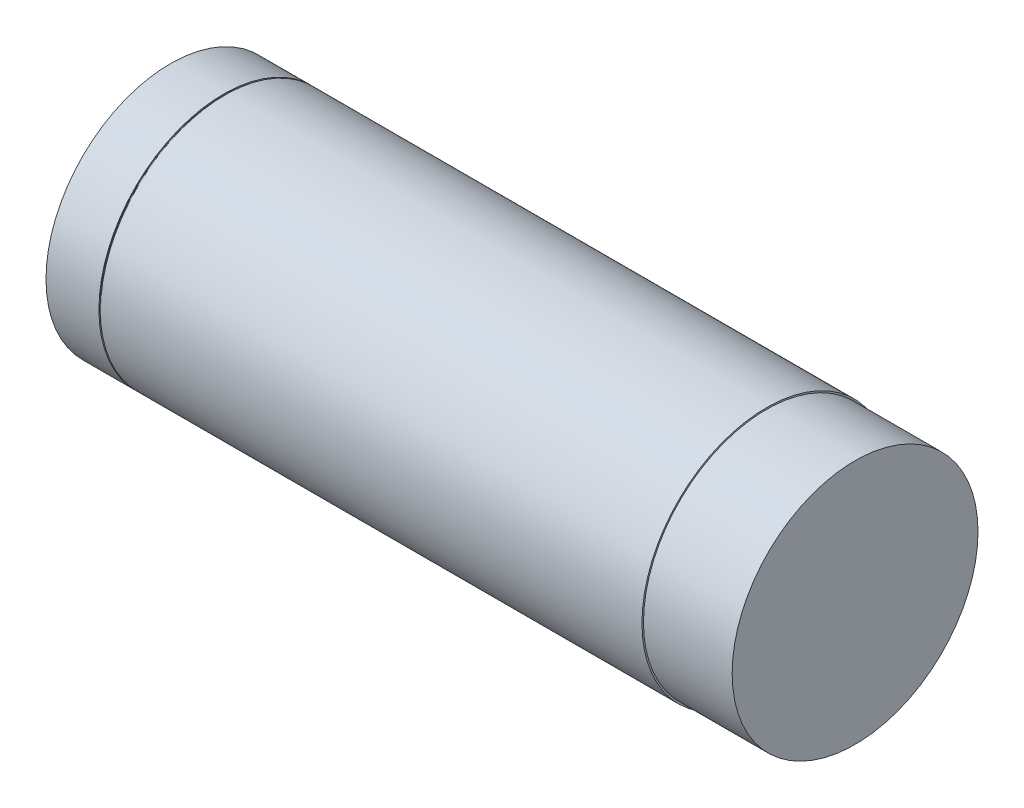
ISO-10303-21;
HEADER;
FILE_DESCRIPTION(('STEP AP214'),'2;1');
FILE_NAME('part.step','',(''),(''),'','','');
FILE_SCHEMA(('AUTOMOTIVE_DESIGN { 1 0 10303 214 1 1 1 1 }'));
ENDSEC;
DATA;
#1=APPLICATION_CONTEXT('core data for automotive mechanical design processes');
#2=APPLICATION_PROTOCOL_DEFINITION('international standard','automotive_design',2000,#1);
#3=PRODUCT_CONTEXT('',#1,'mechanical');
#4=PRODUCT('Part','Part','',(#3));
#5=PRODUCT_RELATED_PRODUCT_CATEGORY('part','',(#4));
#6=PRODUCT_DEFINITION_FORMATION('','',#4);
#7=PRODUCT_DEFINITION_CONTEXT('part definition',#1,'design');
#8=PRODUCT_DEFINITION('design','',#6,#7);
#9=PRODUCT_DEFINITION_SHAPE('','',#8);
#10=(LENGTH_UNIT() NAMED_UNIT(*) SI_UNIT(.MILLI.,.METRE.));
#11=(NAMED_UNIT(*) PLANE_ANGLE_UNIT() SI_UNIT($,.RADIAN.));
#12=(NAMED_UNIT(*) SI_UNIT($,.STERADIAN.) SOLID_ANGLE_UNIT());
#13=UNCERTAINTY_MEASURE_WITH_UNIT(LENGTH_MEASURE(1.E-05),#10,'distance_accuracy_value','');
#14=(GEOMETRIC_REPRESENTATION_CONTEXT(3) GLOBAL_UNCERTAINTY_ASSIGNED_CONTEXT((#13)) GLOBAL_UNIT_ASSIGNED_CONTEXT((#10,
#11,#12)) REPRESENTATION_CONTEXT('',''));
#15=CARTESIAN_POINT('',(0.,0.,0.));
#16=DIRECTION('',(0.,0.,1.));
#17=DIRECTION('',(1.,0.,0.));
#18=AXIS2_PLACEMENT_3D('',#15,#16,#17);
#19=CARTESIAN_POINT('',(0.,0.,0.));
#20=DIRECTION('',(1.,0.,0.));
#21=DIRECTION('',(0.,0.,-1.));
#22=AXIS2_PLACEMENT_3D('',#19,#20,#21);
#23=PLANE('',#22);
#24=DIRECTION('',(0.,0.866025403784439,-0.5));
#25=VECTOR('',#24,1.);
#26=CARTESIAN_POINT('',(0.,0.,4.61880215351701));
#27=LINE('',#26,#25);
#28=CARTESIAN_POINT('',(0.,0.,4.61880215351701));
#29=VERTEX_POINT('',#28);
#30=CARTESIAN_POINT('',(0.,4.,2.30940107675851));
#31=VERTEX_POINT('',#30);
#32=EDGE_CURVE('E122',#29,#31,#27,.T.);
#33=ORIENTED_EDGE('',*,*,#32,.F.);
#34=DIRECTION('',(0.,0.866025403784439,0.5));
#35=VECTOR('',#34,1.);
#36=CARTESIAN_POINT('',(0.,-4.,2.30940107675851));
#37=LINE('',#36,#35);
#38=CARTESIAN_POINT('',(0.,-4.,2.30940107675851));
#39=VERTEX_POINT('',#38);
#40=EDGE_CURVE('E28',#39,#29,#37,.T.);
#41=ORIENTED_EDGE('',*,*,#40,.F.);
#42=DIRECTION('',(0.,0.,1.));
#43=VECTOR('',#42,1.);
#44=CARTESIAN_POINT('',(0.,-4.,-2.30940107675851));
#45=LINE('',#44,#43);
#46=CARTESIAN_POINT('',(0.,-4.,-2.30940107675851));
#47=VERTEX_POINT('',#46);
#48=EDGE_CURVE('E108',#47,#39,#45,.T.);
#49=ORIENTED_EDGE('',*,*,#48,.F.);
#50=DIRECTION('',(0.,-0.866025403784439,0.5));
#51=VECTOR('',#50,1.);
#52=CARTESIAN_POINT('',(0.,0.,-4.61880215351701));
#53=LINE('',#52,#51);
#54=CARTESIAN_POINT('',(0.,0.,-4.61880215351701));
#55=VERTEX_POINT('',#54);
#56=EDGE_CURVE('E111',#55,#47,#53,.T.);
#57=ORIENTED_EDGE('',*,*,#56,.F.);
#58=DIRECTION('',(0.,-0.866025403784439,-0.5));
#59=VECTOR('',#58,1.);
#60=CARTESIAN_POINT('',(0.,4.,-2.30940107675851));
#61=LINE('',#60,#59);
#62=CARTESIAN_POINT('',(0.,4.,-2.30940107675851));
#63=VERTEX_POINT('',#62);
#64=EDGE_CURVE('E127',#63,#55,#61,.T.);
#65=ORIENTED_EDGE('',*,*,#64,.F.);
#66=DIRECTION('',(0.,0.,-1.));
#67=VECTOR('',#66,1.);
#68=CARTESIAN_POINT('',(0.,4.,2.30940107675851));
#69=LINE('',#68,#67);
#70=EDGE_CURVE('E124',#31,#63,#69,.T.);
#71=ORIENTED_EDGE('',*,*,#70,.F.);
#72=EDGE_LOOP('',(#33,#41,#49,#57,#65,#71));
#73=FACE_BOUND('',#72,.T.);
#74=CARTESIAN_POINT('',(0.,0.,0.));
#75=DIRECTION('',(-1.,0.,0.));
#76=DIRECTION('',(0.,0.,1.));
#77=AXIS2_PLACEMENT_3D('',#74,#75,#76);
#78=CIRCLE('',#77,20.);
#79=CARTESIAN_POINT('',(0.,0.,20.));
#80=VERTEX_POINT('',#79);
#81=EDGE_CURVE('E9',#80,#80,#78,.T.);
#82=ORIENTED_EDGE('',*,*,#81,.T.);
#83=EDGE_LOOP('',(#82));
#84=FACE_BOUND('',#83,.T.);
#85=ADVANCED_FACE('F14',(#73,#84),#23,.F.);
#86=CARTESIAN_POINT('',(0.,0.,0.));
#87=DIRECTION('',(-1.,0.,0.));
#88=DIRECTION('',(0.,0.,1.));
#89=AXIS2_PLACEMENT_3D('',#86,#87,#88);
#90=CYLINDRICAL_SURFACE('',#89,20.);
#91=ORIENTED_EDGE('',*,*,#81,.F.);
#92=EDGE_LOOP('',(#91));
#93=FACE_BOUND('',#92,.T.);
#94=CARTESIAN_POINT('',(10.,0.,0.));
#95=DIRECTION('',(-1.,0.,0.));
#96=DIRECTION('',(0.,0.,1.));
#97=AXIS2_PLACEMENT_3D('',#94,#95,#96);
#98=CIRCLE('',#97,20.);
#99=CARTESIAN_POINT('',(10.,0.,20.));
#100=VERTEX_POINT('',#99);
#101=EDGE_CURVE('E21',#100,#100,#98,.T.);
#102=ORIENTED_EDGE('',*,*,#101,.T.);
#103=EDGE_LOOP('',(#102));
#104=FACE_BOUND('',#103,.T.);
#105=ADVANCED_FACE('F215',(#93,#104),#90,.T.);
#106=CARTESIAN_POINT('',(10.,20.,0.));
#107=DIRECTION('',(1.,0.,0.));
#108=DIRECTION('',(0.,0.,-1.));
#109=AXIS2_PLACEMENT_3D('',#106,#107,#108);
#110=PLANE('',#109);
#111=CARTESIAN_POINT('',(10.,19.7989898732235,19.7989898732231));
#112=DIRECTION('',(-1.,0.,0.));
#113=DIRECTION('',(0.,0.,1.));
#114=AXIS2_PLACEMENT_3D('',#111,#112,#113);
#115=CIRCLE('',#114,2.1);
#116=CARTESIAN_POINT('',(10.,19.7989898732235,21.8989898732231));
#117=VERTEX_POINT('',#116);
#118=EDGE_CURVE('E134',#117,#117,#115,.T.);
#119=ORIENTED_EDGE('',*,*,#118,.F.);
#120=EDGE_LOOP('',(#119));
#121=FACE_BOUND('',#120,.T.);
#122=CARTESIAN_POINT('',(10.,2.93615163734981E-13,28.));
#123=DIRECTION('',(-1.,0.,0.));
#124=DIRECTION('',(0.,0.,1.));
#125=AXIS2_PLACEMENT_3D('',#122,#123,#124);
#126=CIRCLE('',#125,2.1);
#127=CARTESIAN_POINT('',(10.,2.93615163734981E-13,30.1));
#128=VERTEX_POINT('',#127);
#129=EDGE_CURVE('E147',#128,#128,#126,.T.);
#130=ORIENTED_EDGE('',*,*,#129,.F.);
#131=EDGE_LOOP('',(#130));
#132=FACE_BOUND('',#131,.T.);
#133=CARTESIAN_POINT('',(10.,-19.7989898732231,19.7989898732235));
#134=DIRECTION('',(-1.,0.,0.));
#135=DIRECTION('',(0.,0.,1.));
#136=AXIS2_PLACEMENT_3D('',#133,#134,#135);
#137=CIRCLE('',#136,2.1);
#138=CARTESIAN_POINT('',(10.,-19.7989898732231,21.8989898732235));
#139=VERTEX_POINT('',#138);
#140=EDGE_CURVE('E153',#139,#139,#137,.T.);
#141=ORIENTED_EDGE('',*,*,#140,.F.);
#142=EDGE_LOOP('',(#141));
#143=FACE_BOUND('',#142,.T.);
#144=CARTESIAN_POINT('',(10.,-28.,0.));
#145=DIRECTION('',(-1.,0.,0.));
#146=DIRECTION('',(0.,0.,1.));
#147=AXIS2_PLACEMENT_3D('',#144,#145,#146);
#148=CIRCLE('',#147,2.1);
#149=CARTESIAN_POINT('',(10.,-28.,2.1));
#150=VERTEX_POINT('',#149);
#151=EDGE_CURVE('E159',#150,#150,#148,.T.);
#152=ORIENTED_EDGE('',*,*,#151,.F.);
#153=EDGE_LOOP('',(#152));
#154=FACE_BOUND('',#153,.T.);
#155=CARTESIAN_POINT('',(10.,-19.7989898732234,-19.7989898732232));
#156=DIRECTION('',(-1.,0.,0.));
#157=DIRECTION('',(0.,0.,1.));
#158=AXIS2_PLACEMENT_3D('',#155,#156,#157);
#159=CIRCLE('',#158,2.1);
#160=CARTESIAN_POINT('',(10.,-19.7989898732234,-17.6989898732232));
#161=VERTEX_POINT('',#160);
#162=EDGE_CURVE('E165',#161,#161,#159,.T.);
#163=ORIENTED_EDGE('',*,*,#162,.F.);
#164=EDGE_LOOP('',(#163));
#165=FACE_BOUND('',#164,.T.);
#166=CARTESIAN_POINT('',(10.,0.,-28.));
#167=DIRECTION('',(-1.,0.,0.));
#168=DIRECTION('',(0.,0.,1.));
#169=AXIS2_PLACEMENT_3D('',#166,#167,#168);
#170=CIRCLE('',#169,2.1);
#171=CARTESIAN_POINT('',(10.,0.,-25.9));
#172=VERTEX_POINT('',#171);
#173=EDGE_CURVE('E171',#172,#172,#170,.T.);
#174=ORIENTED_EDGE('',*,*,#173,.F.);
#175=EDGE_LOOP('',(#174));
#176=FACE_BOUND('',#175,.T.);
#177=CARTESIAN_POINT('',(10.,19.7989898732233,-19.7989898732233));
#178=DIRECTION('',(-1.,0.,0.));
#179=DIRECTION('',(0.,0.,1.));
#180=AXIS2_PLACEMENT_3D('',#177,#178,#179);
#181=CIRCLE('',#180,2.1);
#182=CARTESIAN_POINT('',(10.,19.7989898732233,-17.6989898732233));
#183=VERTEX_POINT('',#182);
#184=EDGE_CURVE('E177',#183,#183,#181,.T.);
#185=ORIENTED_EDGE('',*,*,#184,.F.);
#186=EDGE_LOOP('',(#185));
#187=FACE_BOUND('',#186,.T.);
#188=CARTESIAN_POINT('',(10.,28.,0.));
#189=DIRECTION('',(-1.,0.,0.));
#190=DIRECTION('',(0.,0.,1.));
#191=AXIS2_PLACEMENT_3D('',#188,#189,#190);
#192=CIRCLE('',#191,2.1);
#193=CARTESIAN_POINT('',(10.,28.,2.1));
#194=VERTEX_POINT('',#193);
#195=EDGE_CURVE('E183',#194,#194,#192,.T.);
#196=ORIENTED_EDGE('',*,*,#195,.F.);
#197=EDGE_LOOP('',(#196));
#198=FACE_BOUND('',#197,.T.);
#199=ORIENTED_EDGE('',*,*,#101,.F.);
#200=EDGE_LOOP('',(#199));
#201=FACE_BOUND('',#200,.T.);
#202=CARTESIAN_POINT('',(10.,0.,0.));
#203=DIRECTION('',(-1.,0.,0.));
#204=DIRECTION('',(0.,0.,1.));
#205=AXIS2_PLACEMENT_3D('',#202,#203,#204);
#206=CIRCLE('',#205,40.);
#207=CARTESIAN_POINT('',(10.,0.,40.));
#208=VERTEX_POINT('',#207);
#209=EDGE_CURVE('E210',#208,#208,#206,.T.);
#210=ORIENTED_EDGE('',*,*,#209,.T.);
#211=EDGE_LOOP('',(#210));
#212=FACE_BOUND('',#211,.T.);
#213=ADVANCED_FACE('F217',(#121,#132,#143,#154,#165,#176,#187,#198,#201,#212),#110,.F.);
#214=CARTESIAN_POINT('',(0.,0.,0.));
#215=DIRECTION('',(-1.,0.,0.));
#216=DIRECTION('',(0.,0.,1.));
#217=AXIS2_PLACEMENT_3D('',#214,#215,#216);
#218=CYLINDRICAL_SURFACE('',#217,40.);
#219=ORIENTED_EDGE('',*,*,#209,.F.);
#220=EDGE_LOOP('',(#219));
#221=FACE_BOUND('',#220,.T.);
#222=CARTESIAN_POINT('',(27.,0.,0.));
#223=DIRECTION('',(-1.,0.,0.));
#224=DIRECTION('',(0.,0.,1.));
#225=AXIS2_PLACEMENT_3D('',#222,#223,#224);
#226=CIRCLE('',#225,40.);
#227=CARTESIAN_POINT('',(27.,0.,40.));
#228=VERTEX_POINT('',#227);
#229=EDGE_CURVE('E207',#228,#228,#226,.T.);
#230=ORIENTED_EDGE('',*,*,#229,.T.);
#231=EDGE_LOOP('',(#230));
#232=FACE_BOUND('',#231,.T.);
#233=ADVANCED_FACE('F220',(#221,#232),#218,.T.);
#234=CARTESIAN_POINT('',(27.,40.,0.));
#235=DIRECTION('',(-1.,0.,0.));
#236=DIRECTION('',(0.,0.,1.));
#237=AXIS2_PLACEMENT_3D('',#234,#235,#236);
#238=PLANE('',#237);
#239=ORIENTED_EDGE('',*,*,#229,.F.);
#240=EDGE_LOOP('',(#239));
#241=FACE_BOUND('',#240,.T.);
#242=CARTESIAN_POINT('',(27.,0.,0.));
#243=DIRECTION('',(-1.,0.,0.));
#244=DIRECTION('',(0.,0.,1.));
#245=AXIS2_PLACEMENT_3D('',#242,#243,#244);
#246=CIRCLE('',#245,39.6464466094068);
#247=CARTESIAN_POINT('',(27.,0.,39.6464466094068));
#248=VERTEX_POINT('',#247);
#249=EDGE_CURVE('E204',#248,#248,#246,.T.);
#250=ORIENTED_EDGE('',*,*,#249,.T.);
#251=EDGE_LOOP('',(#250));
#252=FACE_BOUND('',#251,.T.);
#253=ADVANCED_FACE('F227',(#241,#252),#238,.F.);
#254=CARTESIAN_POINT('',(0.,0.,0.));
#255=DIRECTION('',(-1.,0.,0.));
#256=DIRECTION('',(0.,0.,1.));
#257=AXIS2_PLACEMENT_3D('',#254,#255,#256);
#258=CYLINDRICAL_SURFACE('',#257,39.6464466094068);
#259=ORIENTED_EDGE('',*,*,#249,.F.);
#260=EDGE_LOOP('',(#259));
#261=FACE_BOUND('',#260,.T.);
#262=CARTESIAN_POINT('',(27.5,0.,0.));
#263=DIRECTION('',(-1.,0.,0.));
#264=DIRECTION('',(0.,0.,1.));
#265=AXIS2_PLACEMENT_3D('',#262,#263,#264);
#266=CIRCLE('',#265,39.6464466094068);
#267=CARTESIAN_POINT('',(27.5,0.,39.6464466094068));
#268=VERTEX_POINT('',#267);
#269=EDGE_CURVE('E201',#268,#268,#266,.T.);
#270=ORIENTED_EDGE('',*,*,#269,.T.);
#271=EDGE_LOOP('',(#270));
#272=FACE_BOUND('',#271,.T.);
#273=ADVANCED_FACE('F233',(#261,#272),#258,.T.);
#274=CARTESIAN_POINT('',(27.5,39.6464466094068,0.));
#275=DIRECTION('',(1.,0.,0.));
#276=DIRECTION('',(0.,0.,-1.));
#277=AXIS2_PLACEMENT_3D('',#274,#275,#276);
#278=PLANE('',#277);
#279=ORIENTED_EDGE('',*,*,#269,.F.);
#280=EDGE_LOOP('',(#279));
#281=FACE_BOUND('',#280,.T.);
#282=CARTESIAN_POINT('',(27.5,0.,0.));
#283=DIRECTION('',(-1.,0.,0.));
#284=DIRECTION('',(0.,0.,1.));
#285=AXIS2_PLACEMENT_3D('',#282,#283,#284);
#286=CIRCLE('',#285,40.);
#287=CARTESIAN_POINT('',(27.5,0.,40.));
#288=VERTEX_POINT('',#287);
#289=EDGE_CURVE('E198',#288,#288,#286,.T.);
#290=ORIENTED_EDGE('',*,*,#289,.T.);
#291=EDGE_LOOP('',(#290));
#292=FACE_BOUND('',#291,.T.);
#293=ADVANCED_FACE('F239',(#281,#292),#278,.F.);
#294=CARTESIAN_POINT('',(0.,0.,0.));
#295=DIRECTION('',(-1.,0.,0.));
#296=DIRECTION('',(0.,0.,1.));
#297=AXIS2_PLACEMENT_3D('',#294,#295,#296);
#298=CYLINDRICAL_SURFACE('',#297,40.);
#299=ORIENTED_EDGE('',*,*,#289,.F.);
#300=EDGE_LOOP('',(#299));
#301=FACE_BOUND('',#300,.T.);
#302=CARTESIAN_POINT('',(201.506329113924,0.,0.));
#303=DIRECTION('',(-1.,0.,0.));
#304=DIRECTION('',(0.,0.,1.));
#305=AXIS2_PLACEMENT_3D('',#302,#303,#304);
#306=CIRCLE('',#305,40.);
#307=CARTESIAN_POINT('',(201.506329113924,0.,40.));
#308=VERTEX_POINT('',#307);
#309=EDGE_CURVE('E195',#308,#308,#306,.T.);
#310=ORIENTED_EDGE('',*,*,#309,.T.);
#311=EDGE_LOOP('',(#310));
#312=FACE_BOUND('',#311,.T.);
#313=ADVANCED_FACE('F245',(#301,#312),#298,.T.);
#314=CARTESIAN_POINT('',(201.5,0.,0.));
#315=DIRECTION('',(1.,0.,0.));
#316=DIRECTION('',(0.,0.,-1.));
#317=AXIS2_PLACEMENT_3D('',#314,#315,#316);
#318=CONICAL_SURFACE('',#317,39.5,1.55813877496082);
#319=ORIENTED_EDGE('',*,*,#309,.F.);
#320=EDGE_LOOP('',(#319));
#321=FACE_BOUND('',#320,.T.);
#322=CARTESIAN_POINT('',(201.5,0.,0.));
#323=DIRECTION('',(-1.,0.,0.));
#324=DIRECTION('',(0.,0.,1.));
#325=AXIS2_PLACEMENT_3D('',#322,#323,#324);
#326=CIRCLE('',#325,39.5);
#327=CARTESIAN_POINT('',(201.5,0.,39.5));
#328=VERTEX_POINT('',#327);
#329=EDGE_CURVE('E192',#328,#328,#326,.T.);
#330=ORIENTED_EDGE('',*,*,#329,.T.);
#331=EDGE_LOOP('',(#330));
#332=FACE_BOUND('',#331,.T.);
#333=ADVANCED_FACE('F251',(#321,#332),#318,.F.);
#334=CARTESIAN_POINT('',(0.,0.,0.));
#335=DIRECTION('',(-1.,0.,0.));
#336=DIRECTION('',(0.,0.,1.));
#337=AXIS2_PLACEMENT_3D('',#334,#335,#336);
#338=CYLINDRICAL_SURFACE('',#337,39.5);
#339=ORIENTED_EDGE('',*,*,#329,.F.);
#340=EDGE_LOOP('',(#339));
#341=FACE_BOUND('',#340,.T.);
#342=CARTESIAN_POINT('',(230.,0.,0.));
#343=DIRECTION('',(-1.,0.,0.));
#344=DIRECTION('',(0.,0.,1.));
#345=AXIS2_PLACEMENT_3D('',#342,#343,#344);
#346=CIRCLE('',#345,39.5);
#347=CARTESIAN_POINT('',(230.,0.,39.5));
#348=VERTEX_POINT('',#347);
#349=EDGE_CURVE('E189',#348,#348,#346,.T.);
#350=ORIENTED_EDGE('',*,*,#349,.T.);
#351=EDGE_LOOP('',(#350));
#352=FACE_BOUND('',#351,.T.);
#353=ADVANCED_FACE('F257',(#341,#352),#338,.T.);
#354=CARTESIAN_POINT('',(230.,39.5,0.));
#355=DIRECTION('',(-1.,0.,0.));
#356=DIRECTION('',(0.,0.,1.));
#357=AXIS2_PLACEMENT_3D('',#354,#355,#356);
#358=PLANE('',#357);
#359=ORIENTED_EDGE('',*,*,#349,.F.);
#360=EDGE_LOOP('',(#359));
#361=FACE_BOUND('',#360,.T.);
#362=ADVANCED_FACE('F263',(#361),#358,.F.);
#363=CARTESIAN_POINT('',(21.,28.,0.));
#364=DIRECTION('',(-1.,0.,0.));
#365=DIRECTION('',(0.,0.,1.));
#366=AXIS2_PLACEMENT_3D('',#363,#364,#365);
#367=CONICAL_SURFACE('',#366,2.1,1.0471975511966);
#368=CARTESIAN_POINT('',(22.2124355652982,28.,0.));
#369=VERTEX_POINT('',#368);
#370=VERTEX_LOOP('',#369);
#371=FACE_BOUND('',#370,.T.);
#372=CARTESIAN_POINT('',(21.,28.,0.));
#373=DIRECTION('',(-1.,0.,0.));
#374=DIRECTION('',(0.,0.,1.));
#375=AXIS2_PLACEMENT_3D('',#372,#373,#374);
#376=CIRCLE('',#375,2.1);
#377=CARTESIAN_POINT('',(21.,28.,2.1));
#378=VERTEX_POINT('',#377);
#379=EDGE_CURVE('E186',#378,#378,#376,.T.);
#380=ORIENTED_EDGE('',*,*,#379,.T.);
#381=EDGE_LOOP('',(#380));
#382=FACE_BOUND('',#381,.T.);
#383=ADVANCED_FACE('F268',(#371,#382),#367,.F.);
#384=CARTESIAN_POINT('',(10.,28.,0.));
#385=DIRECTION('',(-1.,0.,0.));
#386=DIRECTION('',(0.,0.,1.));
#387=AXIS2_PLACEMENT_3D('',#384,#385,#386);
#388=CYLINDRICAL_SURFACE('',#387,2.1);
#389=ORIENTED_EDGE('',*,*,#379,.F.);
#390=EDGE_LOOP('',(#389));
#391=FACE_BOUND('',#390,.T.);
#392=ORIENTED_EDGE('',*,*,#195,.T.);
#393=EDGE_LOOP('',(#392));
#394=FACE_BOUND('',#393,.T.);
#395=ADVANCED_FACE('F274',(#391,#394),#388,.F.);
#396=CARTESIAN_POINT('',(21.,19.7989898732233,-19.7989898732233));
#397=DIRECTION('',(-1.,0.,0.));
#398=DIRECTION('',(0.,0.,1.));
#399=AXIS2_PLACEMENT_3D('',#396,#397,#398);
#400=CONICAL_SURFACE('',#399,2.1,1.0471975511966);
#401=CARTESIAN_POINT('',(22.2124355652982,19.7989898732233,-19.7989898732233));
#402=VERTEX_POINT('',#401);
#403=VERTEX_LOOP('',#402);
#404=FACE_BOUND('',#403,.T.);
#405=CARTESIAN_POINT('',(21.,19.7989898732233,-19.7989898732233));
#406=DIRECTION('',(-1.,0.,0.));
#407=DIRECTION('',(0.,0.,1.));
#408=AXIS2_PLACEMENT_3D('',#405,#406,#407);
#409=CIRCLE('',#408,2.1);
#410=CARTESIAN_POINT('',(21.,19.7989898732233,-17.6989898732233));
#411=VERTEX_POINT('',#410);
#412=EDGE_CURVE('E180',#411,#411,#409,.T.);
#413=ORIENTED_EDGE('',*,*,#412,.T.);
#414=EDGE_LOOP('',(#413));
#415=FACE_BOUND('',#414,.T.);
#416=ADVANCED_FACE('F365',(#404,#415),#400,.F.);
#417=CARTESIAN_POINT('',(10.,19.7989898732233,-19.7989898732233));
#418=DIRECTION('',(-1.,0.,0.));
#419=DIRECTION('',(0.,0.,1.));
#420=AXIS2_PLACEMENT_3D('',#417,#418,#419);
#421=CYLINDRICAL_SURFACE('',#420,2.1);
#422=ORIENTED_EDGE('',*,*,#412,.F.);
#423=EDGE_LOOP('',(#422));
#424=FACE_BOUND('',#423,.T.);
#425=ORIENTED_EDGE('',*,*,#184,.T.);
#426=EDGE_LOOP('',(#425));
#427=FACE_BOUND('',#426,.T.);
#428=ADVANCED_FACE('F361',(#424,#427),#421,.F.);
#429=CARTESIAN_POINT('',(21.,0.,-28.));
#430=DIRECTION('',(-1.,0.,0.));
#431=DIRECTION('',(0.,0.,1.));
#432=AXIS2_PLACEMENT_3D('',#429,#430,#431);
#433=CONICAL_SURFACE('',#432,2.1,1.0471975511966);
#434=CARTESIAN_POINT('',(22.2124355652982,-1.01083279537822E-13,-28.));
#435=VERTEX_POINT('',#434);
#436=VERTEX_LOOP('',#435);
#437=FACE_BOUND('',#436,.T.);
#438=CARTESIAN_POINT('',(21.,0.,-28.));
#439=DIRECTION('',(-1.,0.,0.));
#440=DIRECTION('',(0.,0.,1.));
#441=AXIS2_PLACEMENT_3D('',#438,#439,#440);
#442=CIRCLE('',#441,2.1);
#443=CARTESIAN_POINT('',(21.,0.,-25.9));
#444=VERTEX_POINT('',#443);
#445=EDGE_CURVE('E174',#444,#444,#442,.T.);
#446=ORIENTED_EDGE('',*,*,#445,.T.);
#447=EDGE_LOOP('',(#446));
#448=FACE_BOUND('',#447,.T.);
#449=ADVANCED_FACE('F357',(#437,#448),#433,.F.);
#450=CARTESIAN_POINT('',(10.,0.,-28.));
#451=DIRECTION('',(-1.,0.,0.));
#452=DIRECTION('',(0.,0.,1.));
#453=AXIS2_PLACEMENT_3D('',#450,#451,#452);
#454=CYLINDRICAL_SURFACE('',#453,2.1);
#455=ORIENTED_EDGE('',*,*,#445,.F.);
#456=EDGE_LOOP('',(#455));
#457=FACE_BOUND('',#456,.T.);
#458=ORIENTED_EDGE('',*,*,#173,.T.);
#459=EDGE_LOOP('',(#458));
#460=FACE_BOUND('',#459,.T.);
#461=ADVANCED_FACE('F353',(#457,#460),#454,.F.);
#462=CARTESIAN_POINT('',(21.,-19.7989898732234,-19.7989898732232));
#463=DIRECTION('',(-1.,0.,0.));
#464=DIRECTION('',(0.,0.,1.));
#465=AXIS2_PLACEMENT_3D('',#462,#463,#464);
#466=CONICAL_SURFACE('',#465,2.1,1.0471975511966);
#467=CARTESIAN_POINT('',(22.2124355652982,-19.7989898732234,-19.7989898732232));
#468=VERTEX_POINT('',#467);
#469=VERTEX_LOOP('',#468);
#470=FACE_BOUND('',#469,.T.);
#471=CARTESIAN_POINT('',(21.,-19.7989898732234,-19.7989898732232));
#472=DIRECTION('',(-1.,0.,0.));
#473=DIRECTION('',(0.,0.,1.));
#474=AXIS2_PLACEMENT_3D('',#471,#472,#473);
#475=CIRCLE('',#474,2.1);
#476=CARTESIAN_POINT('',(21.,-19.7989898732234,-17.6989898732232));
#477=VERTEX_POINT('',#476);
#478=EDGE_CURVE('E168',#477,#477,#475,.T.);
#479=ORIENTED_EDGE('',*,*,#478,.T.);
#480=EDGE_LOOP('',(#479));
#481=FACE_BOUND('',#480,.T.);
#482=ADVANCED_FACE('F349',(#470,#481),#466,.F.);
#483=CARTESIAN_POINT('',(10.,-19.7989898732234,-19.7989898732232));
#484=DIRECTION('',(-1.,0.,0.));
#485=DIRECTION('',(0.,0.,1.));
#486=AXIS2_PLACEMENT_3D('',#483,#484,#485);
#487=CYLINDRICAL_SURFACE('',#486,2.1);
#488=ORIENTED_EDGE('',*,*,#478,.F.);
#489=EDGE_LOOP('',(#488));
#490=FACE_BOUND('',#489,.T.);
#491=ORIENTED_EDGE('',*,*,#162,.T.);
#492=EDGE_LOOP('',(#491));
#493=FACE_BOUND('',#492,.T.);
#494=ADVANCED_FACE('F345',(#490,#493),#487,.F.);
#495=CARTESIAN_POINT('',(21.,-28.,0.));
#496=DIRECTION('',(-1.,0.,0.));
#497=DIRECTION('',(0.,0.,1.));
#498=AXIS2_PLACEMENT_3D('',#495,#496,#497);
#499=CONICAL_SURFACE('',#498,2.1,1.0471975511966);
#500=CARTESIAN_POINT('',(22.2124355652982,-28.,0.));
#501=VERTEX_POINT('',#500);
#502=VERTEX_LOOP('',#501);
#503=FACE_BOUND('',#502,.T.);
#504=CARTESIAN_POINT('',(21.,-28.,0.));
#505=DIRECTION('',(-1.,0.,0.));
#506=DIRECTION('',(0.,0.,1.));
#507=AXIS2_PLACEMENT_3D('',#504,#505,#506);
#508=CIRCLE('',#507,2.1);
#509=CARTESIAN_POINT('',(21.,-28.,2.1));
#510=VERTEX_POINT('',#509);
#511=EDGE_CURVE('E162',#510,#510,#508,.T.);
#512=ORIENTED_EDGE('',*,*,#511,.T.);
#513=EDGE_LOOP('',(#512));
#514=FACE_BOUND('',#513,.T.);
#515=ADVANCED_FACE('F341',(#503,#514),#499,.F.);
#516=CARTESIAN_POINT('',(10.,-28.,0.));
#517=DIRECTION('',(-1.,0.,0.));
#518=DIRECTION('',(0.,0.,1.));
#519=AXIS2_PLACEMENT_3D('',#516,#517,#518);
#520=CYLINDRICAL_SURFACE('',#519,2.1);
#521=ORIENTED_EDGE('',*,*,#511,.F.);
#522=EDGE_LOOP('',(#521));
#523=FACE_BOUND('',#522,.T.);
#524=ORIENTED_EDGE('',*,*,#151,.T.);
#525=EDGE_LOOP('',(#524));
#526=FACE_BOUND('',#525,.T.);
#527=ADVANCED_FACE('F337',(#523,#526),#520,.F.);
#528=CARTESIAN_POINT('',(21.,-19.7989898732231,19.7989898732235));
#529=DIRECTION('',(-1.,0.,0.));
#530=DIRECTION('',(0.,0.,1.));
#531=AXIS2_PLACEMENT_3D('',#528,#529,#530);
#532=CONICAL_SURFACE('',#531,2.1,1.0471975511966);
#533=CARTESIAN_POINT('',(22.2124355652982,-19.7989898732231,19.7989898732235));
#534=VERTEX_POINT('',#533);
#535=VERTEX_LOOP('',#534);
#536=FACE_BOUND('',#535,.T.);
#537=CARTESIAN_POINT('',(21.,-19.7989898732231,19.7989898732235));
#538=DIRECTION('',(-1.,0.,0.));
#539=DIRECTION('',(0.,0.,1.));
#540=AXIS2_PLACEMENT_3D('',#537,#538,#539);
#541=CIRCLE('',#540,2.1);
#542=CARTESIAN_POINT('',(21.,-19.7989898732231,21.8989898732235));
#543=VERTEX_POINT('',#542);
#544=EDGE_CURVE('E156',#543,#543,#541,.T.);
#545=ORIENTED_EDGE('',*,*,#544,.T.);
#546=EDGE_LOOP('',(#545));
#547=FACE_BOUND('',#546,.T.);
#548=ADVANCED_FACE('F333',(#536,#547),#532,.F.);
#549=CARTESIAN_POINT('',(10.,-19.7989898732231,19.7989898732235));
#550=DIRECTION('',(-1.,0.,0.));
#551=DIRECTION('',(0.,0.,1.));
#552=AXIS2_PLACEMENT_3D('',#549,#550,#551);
#553=CYLINDRICAL_SURFACE('',#552,2.1);
#554=ORIENTED_EDGE('',*,*,#544,.F.);
#555=EDGE_LOOP('',(#554));
#556=FACE_BOUND('',#555,.T.);
#557=ORIENTED_EDGE('',*,*,#140,.T.);
#558=EDGE_LOOP('',(#557));
#559=FACE_BOUND('',#558,.T.);
#560=ADVANCED_FACE('F329',(#556,#559),#553,.F.);
#561=CARTESIAN_POINT('',(21.,2.93615163734981E-13,28.));
#562=DIRECTION('',(-1.,0.,0.));
#563=DIRECTION('',(0.,0.,1.));
#564=AXIS2_PLACEMENT_3D('',#561,#562,#563);
#565=CONICAL_SURFACE('',#564,2.1,1.0471975511966);
#566=CARTESIAN_POINT('',(22.2124355652982,2.90623979710014E-13,28.));
#567=VERTEX_POINT('',#566);
#568=VERTEX_LOOP('',#567);
#569=FACE_BOUND('',#568,.T.);
#570=CARTESIAN_POINT('',(21.,2.93615163734981E-13,28.));
#571=DIRECTION('',(-1.,0.,0.));
#572=DIRECTION('',(0.,0.,1.));
#573=AXIS2_PLACEMENT_3D('',#570,#571,#572);
#574=CIRCLE('',#573,2.1);
#575=CARTESIAN_POINT('',(21.,2.93615163734981E-13,30.1));
#576=VERTEX_POINT('',#575);
#577=EDGE_CURVE('E150',#576,#576,#574,.T.);
#578=ORIENTED_EDGE('',*,*,#577,.T.);
#579=EDGE_LOOP('',(#578));
#580=FACE_BOUND('',#579,.T.);
#581=ADVANCED_FACE('F325',(#569,#580),#565,.F.);
#582=CARTESIAN_POINT('',(10.,2.93615163734981E-13,28.));
#583=DIRECTION('',(-1.,0.,0.));
#584=DIRECTION('',(0.,0.,1.));
#585=AXIS2_PLACEMENT_3D('',#582,#583,#584);
#586=CYLINDRICAL_SURFACE('',#585,2.1);
#587=ORIENTED_EDGE('',*,*,#577,.F.);
#588=EDGE_LOOP('',(#587));
#589=FACE_BOUND('',#588,.T.);
#590=ORIENTED_EDGE('',*,*,#129,.T.);
#591=EDGE_LOOP('',(#590));
#592=FACE_BOUND('',#591,.T.);
#593=ADVANCED_FACE('F321',(#589,#592),#586,.F.);
#594=CARTESIAN_POINT('',(21.,19.7989898732235,19.7989898732231));
#595=DIRECTION('',(-1.,0.,0.));
#596=DIRECTION('',(0.,0.,1.));
#597=AXIS2_PLACEMENT_3D('',#594,#595,#596);
#598=CONICAL_SURFACE('',#597,2.1,1.0471975511966);
#599=CARTESIAN_POINT('',(22.2124355652982,19.7989898732235,19.7989898732231));
#600=VERTEX_POINT('',#599);
#601=VERTEX_LOOP('',#600);
#602=FACE_BOUND('',#601,.T.);
#603=CARTESIAN_POINT('',(21.,19.7989898732235,19.7989898732231));
#604=DIRECTION('',(-1.,0.,0.));
#605=DIRECTION('',(0.,0.,1.));
#606=AXIS2_PLACEMENT_3D('',#603,#604,#605);
#607=CIRCLE('',#606,2.1);
#608=CARTESIAN_POINT('',(21.,19.7989898732235,21.8989898732231));
#609=VERTEX_POINT('',#608);
#610=EDGE_CURVE('E144',#609,#609,#607,.T.);
#611=ORIENTED_EDGE('',*,*,#610,.T.);
#612=EDGE_LOOP('',(#611));
#613=FACE_BOUND('',#612,.T.);
#614=ADVANCED_FACE('F317',(#602,#613),#598,.F.);
#615=CARTESIAN_POINT('',(10.,19.7989898732235,19.7989898732231));
#616=DIRECTION('',(-1.,0.,0.));
#617=DIRECTION('',(0.,0.,1.));
#618=AXIS2_PLACEMENT_3D('',#615,#616,#617);
#619=CYLINDRICAL_SURFACE('',#618,2.1);
#620=ORIENTED_EDGE('',*,*,#610,.F.);
#621=EDGE_LOOP('',(#620));
#622=FACE_BOUND('',#621,.T.);
#623=ORIENTED_EDGE('',*,*,#118,.T.);
#624=EDGE_LOOP('',(#623));
#625=FACE_BOUND('',#624,.T.);
#626=ADVANCED_FACE('F305',(#622,#625),#619,.F.);
#627=CARTESIAN_POINT('',(10.,-4.,2.30940107675851));
#628=DIRECTION('',(0.,-0.5,0.866025403784439));
#629=DIRECTION('',(0.,-0.866025403784439,-0.5));
#630=AXIS2_PLACEMENT_3D('',#627,#628,#629);
#631=PLANE('',#630);
#632=ORIENTED_EDGE('',*,*,#40,.T.);
#633=DIRECTION('',(-1.,0.,0.));
#634=VECTOR('',#633,1.);
#635=CARTESIAN_POINT('',(10.,0.,4.61880215351701));
#636=LINE('',#635,#634);
#637=CARTESIAN_POINT('',(10.,0.,4.61880215351701));
#638=VERTEX_POINT('',#637);
#639=EDGE_CURVE('E85',#638,#29,#636,.T.);
#640=ORIENTED_EDGE('',*,*,#639,.F.);
#641=DIRECTION('',(0.,0.866025403784439,0.5));
#642=VECTOR('',#641,1.);
#643=CARTESIAN_POINT('',(10.,-4.,2.30940107675851));
#644=LINE('',#643,#642);
#645=CARTESIAN_POINT('',(10.,-4.,2.30940107675851));
#646=VERTEX_POINT('',#645);
#647=EDGE_CURVE('E89',#646,#638,#644,.T.);
#648=ORIENTED_EDGE('',*,*,#647,.F.);
#649=DIRECTION('',(-1.,0.,0.));
#650=VECTOR('',#649,1.);
#651=CARTESIAN_POINT('',(10.,-4.,2.30940107675851));
#652=LINE('',#651,#650);
#653=EDGE_CURVE('E132',#646,#39,#652,.T.);
#654=ORIENTED_EDGE('',*,*,#653,.T.);
#655=EDGE_LOOP('',(#632,#640,#648,#654));
#656=FACE_BOUND('',#655,.T.);
#657=ADVANCED_FACE('F87',(#656),#631,.F.);
#658=CARTESIAN_POINT('',(10.,-4.,-2.30940107675851));
#659=DIRECTION('',(0.,-1.,0.));
#660=DIRECTION('',(0.,0.,-1.));
#661=AXIS2_PLACEMENT_3D('',#658,#659,#660);
#662=PLANE('',#661);
#663=ORIENTED_EDGE('',*,*,#48,.T.);
#664=ORIENTED_EDGE('',*,*,#653,.F.);
#665=DIRECTION('',(0.,0.,1.));
#666=VECTOR('',#665,1.);
#667=CARTESIAN_POINT('',(10.,-4.,-2.30940107675851));
#668=LINE('',#667,#666);
#669=CARTESIAN_POINT('',(10.,-4.,-2.30940107675851));
#670=VERTEX_POINT('',#669);
#671=EDGE_CURVE('E95',#670,#646,#668,.T.);
#672=ORIENTED_EDGE('',*,*,#671,.F.);
#673=DIRECTION('',(-1.,0.,0.));
#674=VECTOR('',#673,1.);
#675=CARTESIAN_POINT('',(10.,-4.,-2.30940107675851));
#676=LINE('',#675,#674);
#677=EDGE_CURVE('E135',#670,#47,#676,.T.);
#678=ORIENTED_EDGE('',*,*,#677,.T.);
#679=EDGE_LOOP('',(#663,#664,#672,#678));
#680=FACE_BOUND('',#679,.T.);
#681=ADVANCED_FACE('F297',(#680),#662,.F.);
#682=CARTESIAN_POINT('',(10.,0.,-4.61880215351701));
#683=DIRECTION('',(0.,-0.5,-0.866025403784439));
#684=DIRECTION('',(0.,0.866025403784439,-0.5));
#685=AXIS2_PLACEMENT_3D('',#682,#683,#684);
#686=PLANE('',#685);
#687=ORIENTED_EDGE('',*,*,#56,.T.);
#688=ORIENTED_EDGE('',*,*,#677,.F.);
#689=DIRECTION('',(0.,-0.866025403784439,0.5));
#690=VECTOR('',#689,1.);
#691=CARTESIAN_POINT('',(10.,0.,-4.61880215351701));
#692=LINE('',#691,#690);
#693=CARTESIAN_POINT('',(10.,0.,-4.61880215351701));
#694=VERTEX_POINT('',#693);
#695=EDGE_CURVE('E118',#694,#670,#692,.T.);
#696=ORIENTED_EDGE('',*,*,#695,.F.);
#697=DIRECTION('',(-1.,0.,0.));
#698=VECTOR('',#697,1.);
#699=CARTESIAN_POINT('',(10.,0.,-4.61880215351701));
#700=LINE('',#699,#698);
#701=EDGE_CURVE('E137',#694,#55,#700,.T.);
#702=ORIENTED_EDGE('',*,*,#701,.T.);
#703=EDGE_LOOP('',(#687,#688,#696,#702));
#704=FACE_BOUND('',#703,.T.);
#705=ADVANCED_FACE('F295',(#704),#686,.F.);
#706=CARTESIAN_POINT('',(10.,4.,-2.30940107675851));
#707=DIRECTION('',(0.,0.5,-0.866025403784439));
#708=DIRECTION('',(0.,0.866025403784439,0.5));
#709=AXIS2_PLACEMENT_3D('',#706,#707,#708);
#710=PLANE('',#709);
#711=ORIENTED_EDGE('',*,*,#64,.T.);
#712=ORIENTED_EDGE('',*,*,#701,.F.);
#713=DIRECTION('',(0.,-0.866025403784439,-0.5));
#714=VECTOR('',#713,1.);
#715=CARTESIAN_POINT('',(10.,4.,-2.30940107675851));
#716=LINE('',#715,#714);
#717=CARTESIAN_POINT('',(10.,4.,-2.30940107675851));
#718=VERTEX_POINT('',#717);
#719=EDGE_CURVE('E115',#718,#694,#716,.T.);
#720=ORIENTED_EDGE('',*,*,#719,.F.);
#721=DIRECTION('',(-1.,0.,0.));
#722=VECTOR('',#721,1.);
#723=CARTESIAN_POINT('',(10.,4.,-2.30940107675851));
#724=LINE('',#723,#722);
#725=EDGE_CURVE('E139',#718,#63,#724,.T.);
#726=ORIENTED_EDGE('',*,*,#725,.T.);
#727=EDGE_LOOP('',(#711,#712,#720,#726));
#728=FACE_BOUND('',#727,.T.);
#729=ADVANCED_FACE('F293',(#728),#710,.F.);
#730=CARTESIAN_POINT('',(10.,4.,2.30940107675851));
#731=DIRECTION('',(0.,1.,0.));
#732=DIRECTION('',(0.,0.,1.));
#733=AXIS2_PLACEMENT_3D('',#730,#731,#732);
#734=PLANE('',#733);
#735=ORIENTED_EDGE('',*,*,#70,.T.);
#736=ORIENTED_EDGE('',*,*,#725,.F.);
#737=DIRECTION('',(0.,0.,-1.));
#738=VECTOR('',#737,1.);
#739=CARTESIAN_POINT('',(10.,4.,2.30940107675851));
#740=LINE('',#739,#738);
#741=CARTESIAN_POINT('',(10.,4.,2.30940107675851));
#742=VERTEX_POINT('',#741);
#743=EDGE_CURVE('E103',#742,#718,#740,.T.);
#744=ORIENTED_EDGE('',*,*,#743,.F.);
#745=DIRECTION('',(-1.,0.,0.));
#746=VECTOR('',#745,1.);
#747=CARTESIAN_POINT('',(10.,4.,2.30940107675851));
#748=LINE('',#747,#746);
#749=EDGE_CURVE('E94',#742,#31,#748,.T.);
#750=ORIENTED_EDGE('',*,*,#749,.T.);
#751=EDGE_LOOP('',(#735,#736,#744,#750));
#752=FACE_BOUND('',#751,.T.);
#753=ADVANCED_FACE('F289',(#752),#734,.F.);
#754=CARTESIAN_POINT('',(10.,0.,4.61880215351701));
#755=DIRECTION('',(0.,0.5,0.866025403784439));
#756=DIRECTION('',(0.,-0.866025403784439,0.5));
#757=AXIS2_PLACEMENT_3D('',#754,#755,#756);
#758=PLANE('',#757);
#759=ORIENTED_EDGE('',*,*,#32,.T.);
#760=ORIENTED_EDGE('',*,*,#749,.F.);
#761=DIRECTION('',(0.,0.866025403784439,-0.5));
#762=VECTOR('',#761,1.);
#763=CARTESIAN_POINT('',(10.,0.,4.61880215351701));
#764=LINE('',#763,#762);
#765=EDGE_CURVE('E98',#638,#742,#764,.T.);
#766=ORIENTED_EDGE('',*,*,#765,.F.);
#767=ORIENTED_EDGE('',*,*,#639,.T.);
#768=EDGE_LOOP('',(#759,#760,#766,#767));
#769=FACE_BOUND('',#768,.T.);
#770=ADVANCED_FACE('F99',(#769),#758,.F.);
#771=CARTESIAN_POINT('',(10.,0.,0.));
#772=DIRECTION('',(-1.,0.,0.));
#773=DIRECTION('',(0.,0.,1.));
#774=AXIS2_PLACEMENT_3D('',#771,#772,#773);
#775=PLANE('',#774);
#776=ORIENTED_EDGE('',*,*,#647,.T.);
#777=ORIENTED_EDGE('',*,*,#765,.T.);
#778=ORIENTED_EDGE('',*,*,#743,.T.);
#779=ORIENTED_EDGE('',*,*,#719,.T.);
#780=ORIENTED_EDGE('',*,*,#695,.T.);
#781=ORIENTED_EDGE('',*,*,#671,.T.);
#782=EDGE_LOOP('',(#776,#777,#778,#779,#780,#781));
#783=FACE_BOUND('',#782,.T.);
#784=ADVANCED_FACE('F105',(#783),#775,.T.);
#785=CLOSED_SHELL('',(#85,#105,#213,#233,#253,#273,#293,#313,#333,#353,#362,#383,#395,#416,#428,
#449,#461,#482,#494,#515,#527,#548,#560,#581,#593,#614,#626,#657,#681,#705,#729,#753,#770,#784));
#786=MANIFOLD_SOLID_BREP('B1',#785);
#787=ADVANCED_BREP_SHAPE_REPRESENTATION('',(#18,#786),#14);
#788=SHAPE_DEFINITION_REPRESENTATION(#9,#787);
ENDSEC;
END-ISO-10303-21;
